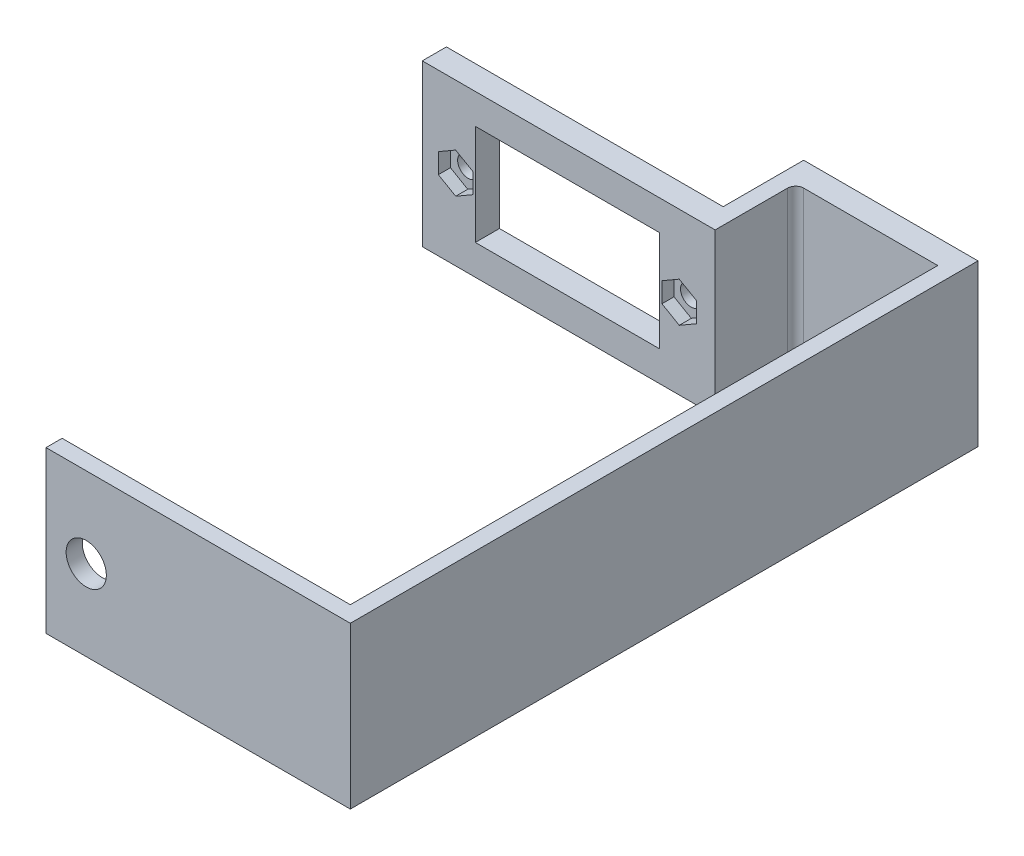
ISO-10303-21;
HEADER;
FILE_DESCRIPTION(('STEP AP214'),'2;1');
FILE_NAME('part.step','',(''),(''),'','','');
FILE_SCHEMA(('AUTOMOTIVE_DESIGN { 1 0 10303 214 1 1 1 1 }'));
ENDSEC;
DATA;
#1=APPLICATION_CONTEXT('core data for automotive mechanical design processes');
#2=APPLICATION_PROTOCOL_DEFINITION('international standard','automotive_design',2000,#1);
#3=PRODUCT_CONTEXT('',#1,'mechanical');
#4=PRODUCT('Part','Part','',(#3));
#5=PRODUCT_RELATED_PRODUCT_CATEGORY('part','',(#4));
#6=PRODUCT_DEFINITION_FORMATION('','',#4);
#7=PRODUCT_DEFINITION_CONTEXT('part definition',#1,'design');
#8=PRODUCT_DEFINITION('design','',#6,#7);
#9=PRODUCT_DEFINITION_SHAPE('','',#8);
#10=(LENGTH_UNIT() NAMED_UNIT(*) SI_UNIT(.MILLI.,.METRE.));
#11=(NAMED_UNIT(*) PLANE_ANGLE_UNIT() SI_UNIT($,.RADIAN.));
#12=(NAMED_UNIT(*) SI_UNIT($,.STERADIAN.) SOLID_ANGLE_UNIT());
#13=UNCERTAINTY_MEASURE_WITH_UNIT(LENGTH_MEASURE(1.E-05),#10,'distance_accuracy_value','');
#14=(GEOMETRIC_REPRESENTATION_CONTEXT(3) GLOBAL_UNCERTAINTY_ASSIGNED_CONTEXT((#13)) GLOBAL_UNIT_ASSIGNED_CONTEXT((#10,
#11,#12)) REPRESENTATION_CONTEXT('',''));
#15=CARTESIAN_POINT('',(0.,0.,0.));
#16=DIRECTION('',(0.,0.,1.));
#17=DIRECTION('',(1.,0.,0.));
#18=AXIS2_PLACEMENT_3D('',#15,#16,#17);
#19=CARTESIAN_POINT('',(0.,0.,-20.6321392575932));
#20=DIRECTION('',(0.,0.,1.));
#21=DIRECTION('',(1.,0.,0.));
#22=AXIS2_PLACEMENT_3D('',#19,#20,#21);
#23=PLANE('',#22);
#24=CARTESIAN_POINT('',(3.92437573669281,-24.8494813758242,-20.6321392575932));
#25=DIRECTION('',(0.,0.,-1.));
#26=DIRECTION('',(-1.,0.,0.));
#27=AXIS2_PLACEMENT_3D('',#24,#25,#26);
#28=CIRCLE('',#27,1.29999999999999);
#29=CARTESIAN_POINT('',(2.62437573669282,-24.8494813758242,-20.6321392575932));
#30=VERTEX_POINT('',#29);
#31=EDGE_CURVE('E539',#30,#30,#28,.T.);
#32=ORIENTED_EDGE('',*,*,#31,.F.);
#33=EDGE_LOOP('',(#32));
#34=FACE_BOUND('',#33,.T.);
#35=DIRECTION('',(-1.,0.,0.));
#36=VECTOR('',#35,1.);
#37=CARTESIAN_POINT('',(0.,-14.8494813758241,-20.6321392575932));
#38=LINE('',#37,#36);
#39=CARTESIAN_POINT('',(6.42437573669282,-14.8494813758241,-20.6321392575932));
#40=VERTEX_POINT('',#39);
#41=CARTESIAN_POINT('',(-27.9669682603242,-14.8494813758241,-20.6321392575932));
#42=VERTEX_POINT('',#41);
#43=EDGE_CURVE('E392',#40,#42,#38,.T.);
#44=ORIENTED_EDGE('',*,*,#43,.F.);
#45=DIRECTION('',(0.,-1.,0.));
#46=VECTOR('',#45,1.);
#47=CARTESIAN_POINT('',(6.42437573669282,0.,-20.6321392575932));
#48=LINE('',#47,#46);
#49=CARTESIAN_POINT('',(6.42437573669281,-34.8494813758241,-20.6321392575932));
#50=VERTEX_POINT('',#49);
#51=EDGE_CURVE('E359',#40,#50,#48,.T.);
#52=ORIENTED_EDGE('',*,*,#51,.T.);
#53=DIRECTION('',(-1.,0.,0.));
#54=VECTOR('',#53,1.);
#55=CARTESIAN_POINT('',(0.,-34.8494813758241,-20.6321392575932));
#56=LINE('',#55,#54);
#57=CARTESIAN_POINT('',(-27.9669682603242,-34.8494813758241,-20.6321392575932));
#58=VERTEX_POINT('',#57);
#59=EDGE_CURVE('E399',#50,#58,#56,.T.);
#60=ORIENTED_EDGE('',*,*,#59,.T.);
#61=DIRECTION('',(0.,-1.,0.));
#62=VECTOR('',#61,1.);
#63=CARTESIAN_POINT('',(-27.9669682603242,0.,-20.6321392575932));
#64=LINE('',#63,#62);
#65=EDGE_CURVE('E396',#42,#58,#64,.T.);
#66=ORIENTED_EDGE('',*,*,#65,.F.);
#67=EDGE_LOOP('',(#44,#52,#60,#66));
#68=FACE_BOUND('',#67,.T.);
#69=DIRECTION('',(1.,0.,0.));
#70=VECTOR('',#69,1.);
#71=CARTESIAN_POINT('',(0.,-18.5994813758242,-20.6321392575932));
#72=LINE('',#71,#70);
#73=CARTESIAN_POINT('',(-21.3756192633072,-18.5994813758242,-20.6321392575932));
#74=VERTEX_POINT('',#73);
#75=CARTESIAN_POINT('',(1.52437073669281,-18.5994813758242,-20.6321392575932));
#76=VERTEX_POINT('',#75);
#77=EDGE_CURVE('E353',#74,#76,#72,.T.);
#78=ORIENTED_EDGE('',*,*,#77,.F.);
#79=DIRECTION('',(0.,1.,0.));
#80=VECTOR('',#79,1.);
#81=CARTESIAN_POINT('',(-21.3756192633072,0.,-20.6321392575932));
#82=LINE('',#81,#80);
#83=CARTESIAN_POINT('',(-21.3756192633072,-31.0994813758241,-20.6321392575932));
#84=VERTEX_POINT('',#83);
#85=EDGE_CURVE('E389',#84,#74,#82,.T.);
#86=ORIENTED_EDGE('',*,*,#85,.F.);
#87=DIRECTION('',(-1.,0.,0.));
#88=VECTOR('',#87,1.);
#89=CARTESIAN_POINT('',(0.,-31.0994813758242,-20.6321392575932));
#90=LINE('',#89,#88);
#91=CARTESIAN_POINT('',(1.52437073669281,-31.0994813758242,-20.6321392575932));
#92=VERTEX_POINT('',#91);
#93=EDGE_CURVE('E386',#92,#84,#90,.T.);
#94=ORIENTED_EDGE('',*,*,#93,.F.);
#95=DIRECTION('',(0.,-1.,0.));
#96=VECTOR('',#95,1.);
#97=CARTESIAN_POINT('',(1.52437073669281,0.,-20.6321392575932));
#98=LINE('',#97,#96);
#99=EDGE_CURVE('E383',#76,#92,#98,.T.);
#100=ORIENTED_EDGE('',*,*,#99,.F.);
#101=EDGE_LOOP('',(#78,#86,#94,#100));
#102=FACE_BOUND('',#101,.T.);
#103=CARTESIAN_POINT('',(-23.7756242633072,-24.8494813758242,-20.6321392575932));
#104=DIRECTION('',(0.,0.,-1.));
#105=DIRECTION('',(-1.,0.,0.));
#106=AXIS2_PLACEMENT_3D('',#103,#104,#105);
#107=CIRCLE('',#106,1.29999999999999);
#108=CARTESIAN_POINT('',(-25.0756242633072,-24.8494813758242,-20.6321392575932));
#109=VERTEX_POINT('',#108);
#110=EDGE_CURVE('E527',#109,#109,#107,.T.);
#111=ORIENTED_EDGE('',*,*,#110,.F.);
#112=EDGE_LOOP('',(#111));
#113=FACE_BOUND('',#112,.T.);
#114=ADVANCED_FACE('F51',(#34,#68,#102,#113),#23,.F.);
#115=CARTESIAN_POINT('',(0.,0.,-17.6321392575933));
#116=DIRECTION('',(0.,0.,1.));
#117=DIRECTION('',(1.,0.,0.));
#118=AXIS2_PLACEMENT_3D('',#115,#116,#117);
#119=PLANE('',#118);
#120=DIRECTION('',(-1.,0.,0.));
#121=VECTOR('',#120,1.);
#122=CARTESIAN_POINT('',(0.,-14.8494813758241,-17.6321392575933));
#123=LINE('',#122,#121);
#124=CARTESIAN_POINT('',(8.42437573669282,-14.8494813758241,-17.6321392575933));
#125=VERTEX_POINT('',#124);
#126=CARTESIAN_POINT('',(-27.9669682603242,-14.8494813758241,-17.6321392575933));
#127=VERTEX_POINT('',#126);
#128=EDGE_CURVE('E368',#125,#127,#123,.T.);
#129=ORIENTED_EDGE('',*,*,#128,.T.);
#130=DIRECTION('',(0.,-1.,0.));
#131=VECTOR('',#130,1.);
#132=CARTESIAN_POINT('',(-27.9669682603242,0.,-17.6321392575933));
#133=LINE('',#132,#131);
#134=CARTESIAN_POINT('',(-27.9669682603242,-34.8494813758241,-17.6321392575933));
#135=VERTEX_POINT('',#134);
#136=EDGE_CURVE('E372',#127,#135,#133,.T.);
#137=ORIENTED_EDGE('',*,*,#136,.T.);
#138=DIRECTION('',(-1.,0.,0.));
#139=VECTOR('',#138,1.);
#140=CARTESIAN_POINT('',(0.,-34.8494813758241,-17.6321392575933));
#141=LINE('',#140,#139);
#142=CARTESIAN_POINT('',(8.42437573669281,-34.8494813758241,-17.6321392575933));
#143=VERTEX_POINT('',#142);
#144=EDGE_CURVE('E375',#143,#135,#141,.T.);
#145=ORIENTED_EDGE('',*,*,#144,.F.);
#146=DIRECTION('',(0.,-1.,0.));
#147=VECTOR('',#146,1.);
#148=CARTESIAN_POINT('',(8.42437573669282,-14.8494813758241,-17.6321392575933));
#149=LINE('',#148,#147);
#150=EDGE_CURVE('E274',#125,#143,#149,.T.);
#151=ORIENTED_EDGE('',*,*,#150,.F.);
#152=EDGE_LOOP('',(#129,#137,#145,#151));
#153=FACE_BOUND('',#152,.T.);
#154=DIRECTION('',(1.,0.,0.));
#155=VECTOR('',#154,1.);
#156=CARTESIAN_POINT('',(0.,-18.5994813758242,-17.6321392575933));
#157=LINE('',#156,#155);
#158=CARTESIAN_POINT('',(-21.3756192633072,-18.5994813758242,-17.6321392575933));
#159=VERTEX_POINT('',#158);
#160=CARTESIAN_POINT('',(1.52437073669281,-18.5994813758242,-17.6321392575933));
#161=VERTEX_POINT('',#160);
#162=EDGE_CURVE('E354',#159,#161,#157,.T.);
#163=ORIENTED_EDGE('',*,*,#162,.T.);
#164=DIRECTION('',(0.,-1.,0.));
#165=VECTOR('',#164,1.);
#166=CARTESIAN_POINT('',(1.52437073669281,0.,-17.6321392575933));
#167=LINE('',#166,#165);
#168=CARTESIAN_POINT('',(1.52437073669281,-31.0994813758242,-17.6321392575933));
#169=VERTEX_POINT('',#168);
#170=EDGE_CURVE('E358',#161,#169,#167,.T.);
#171=ORIENTED_EDGE('',*,*,#170,.T.);
#172=DIRECTION('',(-1.,0.,0.));
#173=VECTOR('',#172,1.);
#174=CARTESIAN_POINT('',(0.,-31.0994813758242,-17.6321392575933));
#175=LINE('',#174,#173);
#176=CARTESIAN_POINT('',(-21.3756192633072,-31.0994813758241,-17.6321392575933));
#177=VERTEX_POINT('',#176);
#178=EDGE_CURVE('E362',#169,#177,#175,.T.);
#179=ORIENTED_EDGE('',*,*,#178,.T.);
#180=DIRECTION('',(0.,1.,0.));
#181=VECTOR('',#180,1.);
#182=CARTESIAN_POINT('',(-21.3756192633072,0.,-17.6321392575933));
#183=LINE('',#182,#181);
#184=EDGE_CURVE('E365',#177,#159,#183,.T.);
#185=ORIENTED_EDGE('',*,*,#184,.T.);
#186=EDGE_LOOP('',(#163,#171,#179,#185));
#187=FACE_BOUND('',#186,.T.);
#188=DIRECTION('',(-0.866025403784438,0.500000000000001,0.));
#189=VECTOR('',#188,1.);
#190=CARTESIAN_POINT('',(-15.6447755673196,-27.0975461556097,-17.6321392575933));
#191=LINE('',#190,#189);
#192=CARTESIAN_POINT('',(-21.6669682603242,-23.6206315831918,-17.6321392575933));
#193=VERTEX_POINT('',#192);
#194=CARTESIAN_POINT('',(-23.8169682603242,-22.379328504434,-17.6321392575933));
#195=VERTEX_POINT('',#194);
#196=EDGE_CURVE('E77',#193,#195,#191,.T.);
#197=ORIENTED_EDGE('',*,*,#196,.F.);
#198=DIRECTION('',(0.,1.,0.));
#199=VECTOR('',#198,1.);
#200=CARTESIAN_POINT('',(-21.6669682603242,0.,-17.6321392575933));
#201=LINE('',#200,#199);
#202=CARTESIAN_POINT('',(-21.6669682603242,-26.1032377407071,-17.6321392575933));
#203=VERTEX_POINT('',#202);
#204=EDGE_CURVE('E286',#203,#193,#201,.T.);
#205=ORIENTED_EDGE('',*,*,#204,.F.);
#206=DIRECTION('',(0.866025403784438,0.500000000000001,0.));
#207=VECTOR('',#206,1.);
#208=CARTESIAN_POINT('',(5.8862914371575,-10.1953558373144,-17.6321392575933));
#209=LINE('',#208,#207);
#210=CARTESIAN_POINT('',(-23.8169682603242,-27.3445408194648,-17.6321392575933));
#211=VERTEX_POINT('',#210);
#212=EDGE_CURVE('E322',#211,#203,#209,.T.);
#213=ORIENTED_EDGE('',*,*,#212,.F.);
#214=DIRECTION('',(0.866025403784439,-0.5,0.));
#215=VECTOR('',#214,1.);
#216=CARTESIAN_POINT('',(-17.7947755673196,-30.8214553918828,-17.6321392575933));
#217=LINE('',#216,#215);
#218=CARTESIAN_POINT('',(-25.9669682603242,-26.1032377407071,-17.6321392575933));
#219=VERTEX_POINT('',#218);
#220=EDGE_CURVE('E318',#219,#211,#217,.T.);
#221=ORIENTED_EDGE('',*,*,#220,.F.);
#222=DIRECTION('',(0.,-1.,0.));
#223=VECTOR('',#222,1.);
#224=CARTESIAN_POINT('',(-25.9669682603242,0.,-17.6321392575933));
#225=LINE('',#224,#223);
#226=CARTESIAN_POINT('',(-25.9669682603242,-23.6206315831917,-17.6321392575933));
#227=VERTEX_POINT('',#226);
#228=EDGE_CURVE('E314',#227,#219,#225,.T.);
#229=ORIENTED_EDGE('',*,*,#228,.F.);
#230=DIRECTION('',(-0.866025403784438,-0.500000000000001,0.));
#231=VECTOR('',#230,1.);
#232=CARTESIAN_POINT('',(3.7362914371575,-6.47144660104132,-17.6321392575933));
#233=LINE('',#232,#231);
#234=EDGE_CURVE('E309',#195,#227,#233,.T.);
#235=ORIENTED_EDGE('',*,*,#234,.F.);
#236=EDGE_LOOP('',(#197,#205,#213,#221,#229,#235));
#237=FACE_BOUND('',#236,.T.);
#238=DIRECTION('',(0.866025403784439,-0.5,0.));
#239=VECTOR('',#238,1.);
#240=CARTESIAN_POINT('',(-8.69910356881111,-15.0672893614846,-17.6321392575933));
#241=LINE('',#240,#239);
#242=CARTESIAN_POINT('',(3.96571973370978,-22.3793285044341,-17.6321392575933));
#243=VERTEX_POINT('',#242);
#244=CARTESIAN_POINT('',(6.11571973370978,-23.6206315831918,-17.6321392575933));
#245=VERTEX_POINT('',#244);
#246=EDGE_CURVE('E262',#243,#245,#241,.T.);
#247=ORIENTED_EDGE('',*,*,#246,.T.);
#248=DIRECTION('',(0.,-1.,0.));
#249=VECTOR('',#248,1.);
#250=CARTESIAN_POINT('',(6.11571973370978,0.,-17.6321392575933));
#251=LINE('',#250,#249);
#252=CARTESIAN_POINT('',(6.11571973370978,-26.1032377407071,-17.6321392575933));
#253=VERTEX_POINT('',#252);
#254=EDGE_CURVE('E69',#245,#253,#251,.T.);
#255=ORIENTED_EDGE('',*,*,#254,.T.);
#256=DIRECTION('',(-0.866025403784439,-0.499999999999999,0.));
#257=VECTOR('',#256,1.);
#258=CARTESIAN_POINT('',(12.831963435666,-22.2256126314396,-17.6321392575933));
#259=LINE('',#258,#257);
#260=CARTESIAN_POINT('',(3.96571973370977,-27.3445408194648,-17.6321392575933));
#261=VERTEX_POINT('',#260);
#262=EDGE_CURVE('E266',#253,#261,#259,.T.);
#263=ORIENTED_EDGE('',*,*,#262,.T.);
#264=DIRECTION('',(-0.866025403784438,0.500000000000001,0.));
#265=VECTOR('',#264,1.);
#266=CARTESIAN_POINT('',(-10.8491035688111,-18.7911985977576,-17.6321392575933));
#267=LINE('',#266,#265);
#268=CARTESIAN_POINT('',(1.81571973370978,-26.1032377407071,-17.6321392575933));
#269=VERTEX_POINT('',#268);
#270=EDGE_CURVE('E557',#261,#269,#267,.T.);
#271=ORIENTED_EDGE('',*,*,#270,.T.);
#272=DIRECTION('',(0.,1.,0.));
#273=VECTOR('',#272,1.);
#274=CARTESIAN_POINT('',(1.81571973370978,0.,-17.6321392575933));
#275=LINE('',#274,#273);
#276=CARTESIAN_POINT('',(1.81571973370977,-23.6206315831918,-17.6321392575933));
#277=VERTEX_POINT('',#276);
#278=EDGE_CURVE('E561',#269,#277,#275,.T.);
#279=ORIENTED_EDGE('',*,*,#278,.T.);
#280=DIRECTION('',(0.866025403784438,0.5,0.));
#281=VECTOR('',#280,1.);
#282=CARTESIAN_POINT('',(10.681963435666,-18.5017033951665,-17.6321392575933));
#283=LINE('',#282,#281);
#284=EDGE_CURVE('E565',#277,#243,#283,.T.);
#285=ORIENTED_EDGE('',*,*,#284,.T.);
#286=EDGE_LOOP('',(#247,#255,#263,#271,#279,#285));
#287=FACE_BOUND('',#286,.T.);
#288=ADVANCED_FACE('F592',(#153,#187,#237,#287),#119,.T.);
#289=CARTESIAN_POINT('',(28.09,-34.8494813758241,45.3678607424067));
#290=DIRECTION('',(0.,1.,0.));
#291=DIRECTION('',(0.,0.,1.));
#292=AXIS2_PLACEMENT_3D('',#289,#290,#291);
#293=PLANE('',#292);
#294=DIRECTION('',(0.,0.,-1.));
#295=VECTOR('',#294,1.);
#296=CARTESIAN_POINT('',(26.09,-34.8494813758241,45.3678607424067));
#297=LINE('',#296,#295);
#298=CARTESIAN_POINT('',(26.09,-34.8494813758242,45.3678607424067));
#299=VERTEX_POINT('',#298);
#300=CARTESIAN_POINT('',(26.09,-34.8494813758241,-27.6321392575933));
#301=VERTEX_POINT('',#300);
#302=EDGE_CURVE('E496',#299,#301,#297,.T.);
#303=ORIENTED_EDGE('',*,*,#302,.T.);
#304=DIRECTION('',(-1.,0.,0.));
#305=VECTOR('',#304,1.);
#306=CARTESIAN_POINT('',(28.09,-34.8494813758241,-27.6321392575933));
#307=LINE('',#306,#305);
#308=CARTESIAN_POINT('',(9.42437573669282,-34.8494813758241,-27.6321392575933));
#309=VERTEX_POINT('',#308);
#310=EDGE_CURVE('E414',#301,#309,#307,.T.);
#311=ORIENTED_EDGE('',*,*,#310,.T.);
#312=CARTESIAN_POINT('',(9.42437573669282,-34.8494813758241,-26.6321392575933));
#313=DIRECTION('',(0.,1.,0.));
#314=DIRECTION('',(0.,0.,1.));
#315=AXIS2_PLACEMENT_3D('',#312,#313,#314);
#316=CIRCLE('',#315,1.);
#317=CARTESIAN_POINT('',(8.42437573669281,-34.8494813758241,-26.6321392575933));
#318=VERTEX_POINT('',#317);
#319=EDGE_CURVE('E11',#309,#318,#316,.T.);
#320=ORIENTED_EDGE('',*,*,#319,.T.);
#321=DIRECTION('',(0.,0.,-1.));
#322=VECTOR('',#321,1.);
#323=CARTESIAN_POINT('',(8.42437573669281,-34.8494813758241,-17.6321392575933));
#324=LINE('',#323,#322);
#325=EDGE_CURVE('E349',#143,#318,#324,.T.);
#326=ORIENTED_EDGE('',*,*,#325,.F.);
#327=ORIENTED_EDGE('',*,*,#144,.T.);
#328=DIRECTION('',(0.,0.,-1.));
#329=VECTOR('',#328,1.);
#330=CARTESIAN_POINT('',(-27.9669682603242,-34.8494813758241,-17.6321392575933));
#331=LINE('',#330,#329);
#332=EDGE_CURVE('E406',#135,#58,#331,.T.);
#333=ORIENTED_EDGE('',*,*,#332,.T.);
#334=ORIENTED_EDGE('',*,*,#59,.F.);
#335=DIRECTION('',(0.,0.,1.));
#336=VECTOR('',#335,1.);
#337=CARTESIAN_POINT('',(6.42437573669281,-34.8494813758241,-30.6321392575933));
#338=LINE('',#337,#336);
#339=CARTESIAN_POINT('',(6.42437573669281,-34.8494813758241,-30.6321392575933));
#340=VERTEX_POINT('',#339);
#341=EDGE_CURVE('E453',#340,#50,#338,.T.);
#342=ORIENTED_EDGE('',*,*,#341,.F.);
#343=DIRECTION('',(-1.,0.,0.));
#344=VECTOR('',#343,1.);
#345=CARTESIAN_POINT('',(28.09,-34.8494813758241,-30.6321392575933));
#346=LINE('',#345,#344);
#347=CARTESIAN_POINT('',(28.09,-34.8494813758241,-30.6321392575933));
#348=VERTEX_POINT('',#347);
#349=EDGE_CURVE('E429',#348,#340,#346,.T.);
#350=ORIENTED_EDGE('',*,*,#349,.F.);
#351=DIRECTION('',(0.,0.,-1.));
#352=VECTOR('',#351,1.);
#353=CARTESIAN_POINT('',(28.09,-34.8494813758241,45.3678607424067));
#354=LINE('',#353,#352);
#355=CARTESIAN_POINT('',(28.09,-34.8494813758242,47.3678607424068));
#356=VERTEX_POINT('',#355);
#357=EDGE_CURVE('E497',#356,#348,#354,.T.);
#358=ORIENTED_EDGE('',*,*,#357,.F.);
#359=DIRECTION('',(1.,0.,0.));
#360=VECTOR('',#359,1.);
#361=CARTESIAN_POINT('',(28.09,-34.8494813758242,47.3678607424068));
#362=LINE('',#361,#360);
#363=CARTESIAN_POINT('',(-9.72562926330718,-34.8494813758242,47.3678607424068));
#364=VERTEX_POINT('',#363);
#365=EDGE_CURVE('E476',#364,#356,#362,.T.);
#366=ORIENTED_EDGE('',*,*,#365,.F.);
#367=DIRECTION('',(0.,0.,-1.));
#368=VECTOR('',#367,1.);
#369=CARTESIAN_POINT('',(-9.72562926330718,-34.8494813758242,47.3678607424068));
#370=LINE('',#369,#368);
#371=CARTESIAN_POINT('',(-9.72562926330718,-34.8494813758242,45.3678607424067));
#372=VERTEX_POINT('',#371);
#373=EDGE_CURVE('E480',#364,#372,#370,.T.);
#374=ORIENTED_EDGE('',*,*,#373,.T.);
#375=DIRECTION('',(1.,0.,0.));
#376=VECTOR('',#375,1.);
#377=CARTESIAN_POINT('',(28.09,-34.8494813758242,45.3678607424067));
#378=LINE('',#377,#376);
#379=EDGE_CURVE('E470',#372,#299,#378,.T.);
#380=ORIENTED_EDGE('',*,*,#379,.T.);
#381=EDGE_LOOP('',(#303,#311,#320,#326,#327,#333,#334,#342,#350,#358,#366,#374,#380));
#382=FACE_BOUND('',#381,.T.);
#383=ADVANCED_FACE('F613',(#382),#293,.F.);
#384=CARTESIAN_POINT('',(28.09,-14.8494813758241,45.3678607424067));
#385=DIRECTION('',(0.,-1.,0.));
#386=DIRECTION('',(0.,0.,-1.));
#387=AXIS2_PLACEMENT_3D('',#384,#385,#386);
#388=PLANE('',#387);
#389=DIRECTION('',(0.,0.,1.));
#390=VECTOR('',#389,1.);
#391=CARTESIAN_POINT('',(26.09,-14.8494813758241,45.3678607424067));
#392=LINE('',#391,#390);
#393=CARTESIAN_POINT('',(26.09,-14.8494813758241,-27.6321392575933));
#394=VERTEX_POINT('',#393);
#395=CARTESIAN_POINT('',(26.09,-14.8494813758241,45.3678607424067));
#396=VERTEX_POINT('',#395);
#397=EDGE_CURVE('E512',#394,#396,#392,.T.);
#398=ORIENTED_EDGE('',*,*,#397,.T.);
#399=DIRECTION('',(-1.,0.,0.));
#400=VECTOR('',#399,1.);
#401=CARTESIAN_POINT('',(28.09,-14.8494813758241,45.3678607424067));
#402=LINE('',#401,#400);
#403=CARTESIAN_POINT('',(-9.72562926330718,-14.8494813758241,45.3678607424067));
#404=VERTEX_POINT('',#403);
#405=EDGE_CURVE('E461',#396,#404,#402,.T.);
#406=ORIENTED_EDGE('',*,*,#405,.T.);
#407=DIRECTION('',(0.,0.,-1.));
#408=VECTOR('',#407,1.);
#409=CARTESIAN_POINT('',(-9.72562926330718,-14.8494813758241,47.3678607424068));
#410=LINE('',#409,#408);
#411=CARTESIAN_POINT('',(-9.72562926330718,-14.8494813758241,47.3678607424068));
#412=VERTEX_POINT('',#411);
#413=EDGE_CURVE('E492',#412,#404,#410,.T.);
#414=ORIENTED_EDGE('',*,*,#413,.F.);
#415=DIRECTION('',(-1.,0.,0.));
#416=VECTOR('',#415,1.);
#417=CARTESIAN_POINT('',(28.09,-14.8494813758241,47.3678607424068));
#418=LINE('',#417,#416);
#419=CARTESIAN_POINT('',(28.09,-14.8494813758241,47.3678607424068));
#420=VERTEX_POINT('',#419);
#421=EDGE_CURVE('E469',#420,#412,#418,.T.);
#422=ORIENTED_EDGE('',*,*,#421,.F.);
#423=DIRECTION('',(0.,0.,1.));
#424=VECTOR('',#423,1.);
#425=CARTESIAN_POINT('',(28.09,-14.8494813758241,45.3678607424067));
#426=LINE('',#425,#424);
#427=CARTESIAN_POINT('',(28.09,-14.8494813758241,-30.6321392575933));
#428=VERTEX_POINT('',#427);
#429=EDGE_CURVE('E500',#428,#420,#426,.T.);
#430=ORIENTED_EDGE('',*,*,#429,.F.);
#431=DIRECTION('',(1.,0.,0.));
#432=VECTOR('',#431,1.);
#433=CARTESIAN_POINT('',(28.09,-14.8494813758241,-30.6321392575933));
#434=LINE('',#433,#432);
#435=CARTESIAN_POINT('',(6.42437573669282,-14.8494813758241,-30.6321392575933));
#436=VERTEX_POINT('',#435);
#437=EDGE_CURVE('E437',#436,#428,#434,.T.);
#438=ORIENTED_EDGE('',*,*,#437,.F.);
#439=DIRECTION('',(0.,0.,1.));
#440=VECTOR('',#439,1.);
#441=CARTESIAN_POINT('',(6.42437573669282,-14.8494813758241,-30.6321392575933));
#442=LINE('',#441,#440);
#443=EDGE_CURVE('E445',#436,#40,#442,.T.);
#444=ORIENTED_EDGE('',*,*,#443,.T.);
#445=ORIENTED_EDGE('',*,*,#43,.T.);
#446=DIRECTION('',(0.,0.,-1.));
#447=VECTOR('',#446,1.);
#448=CARTESIAN_POINT('',(-27.9669682603242,-14.8494813758241,-17.6321392575933));
#449=LINE('',#448,#447);
#450=EDGE_CURVE('E409',#127,#42,#449,.T.);
#451=ORIENTED_EDGE('',*,*,#450,.F.);
#452=ORIENTED_EDGE('',*,*,#128,.F.);
#453=DIRECTION('',(0.,0.,1.));
#454=VECTOR('',#453,1.);
#455=CARTESIAN_POINT('',(8.42437573669282,-14.8494813758241,-27.6321392575933));
#456=LINE('',#455,#454);
#457=CARTESIAN_POINT('',(8.42437573669282,-14.8494813758241,-26.6321392575933));
#458=VERTEX_POINT('',#457);
#459=EDGE_CURVE('E268',#458,#125,#456,.T.);
#460=ORIENTED_EDGE('',*,*,#459,.F.);
#461=CARTESIAN_POINT('',(9.42437573669282,-14.8494813758241,-26.6321392575933));
#462=DIRECTION('',(0.,-1.,0.));
#463=DIRECTION('',(0.,0.,-1.));
#464=AXIS2_PLACEMENT_3D('',#461,#462,#463);
#465=CIRCLE('',#464,1.);
#466=CARTESIAN_POINT('',(9.42437573669282,-14.8494813758241,-27.6321392575933));
#467=VERTEX_POINT('',#466);
#468=EDGE_CURVE('E61',#458,#467,#465,.T.);
#469=ORIENTED_EDGE('',*,*,#468,.T.);
#470=DIRECTION('',(1.,0.,0.));
#471=VECTOR('',#470,1.);
#472=CARTESIAN_POINT('',(28.09,-14.8494813758241,-27.6321392575933));
#473=LINE('',#472,#471);
#474=EDGE_CURVE('E434',#467,#394,#473,.T.);
#475=ORIENTED_EDGE('',*,*,#474,.T.);
#476=EDGE_LOOP('',(#398,#406,#414,#422,#430,#438,#444,#445,#451,#452,#460,#469,#475));
#477=FACE_BOUND('',#476,.T.);
#478=ADVANCED_FACE('F673',(#477),#388,.F.);
#479=CARTESIAN_POINT('',(28.09,0.,0.));
#480=DIRECTION('',(1.,0.,0.));
#481=DIRECTION('',(0.,0.,-1.));
#482=AXIS2_PLACEMENT_3D('',#479,#480,#481);
#483=PLANE('',#482);
#484=ORIENTED_EDGE('',*,*,#357,.T.);
#485=DIRECTION('',(0.,-1.,0.));
#486=VECTOR('',#485,1.);
#487=CARTESIAN_POINT('',(28.09,-34.8494813758241,-30.6321392575933));
#488=LINE('',#487,#486);
#489=EDGE_CURVE('E441',#428,#348,#488,.T.);
#490=ORIENTED_EDGE('',*,*,#489,.F.);
#491=ORIENTED_EDGE('',*,*,#429,.T.);
#492=DIRECTION('',(0.,1.,0.));
#493=VECTOR('',#492,1.);
#494=CARTESIAN_POINT('',(28.09,-34.8494813758242,47.3678607424068));
#495=LINE('',#494,#493);
#496=EDGE_CURVE('E465',#356,#420,#495,.T.);
#497=ORIENTED_EDGE('',*,*,#496,.F.);
#498=EDGE_LOOP('',(#484,#490,#491,#497));
#499=FACE_BOUND('',#498,.T.);
#500=ADVANCED_FACE('F670',(#499),#483,.T.);
#501=CARTESIAN_POINT('',(26.09,0.,0.));
#502=DIRECTION('',(1.,0.,0.));
#503=DIRECTION('',(0.,0.,-1.));
#504=AXIS2_PLACEMENT_3D('',#501,#502,#503);
#505=PLANE('',#504);
#506=ORIENTED_EDGE('',*,*,#302,.F.);
#507=DIRECTION('',(0.,-1.,0.));
#508=VECTOR('',#507,1.);
#509=CARTESIAN_POINT('',(26.09,-34.8494813758241,45.3678607424067));
#510=LINE('',#509,#508);
#511=EDGE_CURVE('E501',#396,#299,#510,.T.);
#512=ORIENTED_EDGE('',*,*,#511,.F.);
#513=ORIENTED_EDGE('',*,*,#397,.F.);
#514=DIRECTION('',(0.,1.,0.));
#515=VECTOR('',#514,1.);
#516=CARTESIAN_POINT('',(26.09,-34.8494813758241,-27.6321392575933));
#517=LINE('',#516,#515);
#518=EDGE_CURVE('E508',#301,#394,#517,.T.);
#519=ORIENTED_EDGE('',*,*,#518,.F.);
#520=EDGE_LOOP('',(#506,#512,#513,#519));
#521=FACE_BOUND('',#520,.T.);
#522=ADVANCED_FACE('F665',(#521),#505,.F.);
#523=CARTESIAN_POINT('',(0.,0.,45.3678607424067));
#524=DIRECTION('',(0.,0.,1.));
#525=DIRECTION('',(1.,0.,0.));
#526=AXIS2_PLACEMENT_3D('',#523,#524,#525);
#527=PLANE('',#526);
#528=CARTESIAN_POINT('',(-4.72562926330719,-24.8494813758241,45.3678607424067));
#529=DIRECTION('',(0.,0.,1.));
#530=DIRECTION('',(1.,0.,0.));
#531=AXIS2_PLACEMENT_3D('',#528,#529,#530);
#532=CIRCLE('',#531,2.5);
#533=CARTESIAN_POINT('',(-2.22562926330719,-24.8494813758241,45.3678607424067));
#534=VERTEX_POINT('',#533);
#535=EDGE_CURVE('E456',#534,#534,#532,.T.);
#536=ORIENTED_EDGE('',*,*,#535,.T.);
#537=EDGE_LOOP('',(#536));
#538=FACE_BOUND('',#537,.T.);
#539=ORIENTED_EDGE('',*,*,#405,.F.);
#540=ORIENTED_EDGE('',*,*,#511,.T.);
#541=ORIENTED_EDGE('',*,*,#379,.F.);
#542=DIRECTION('',(0.,-1.,0.));
#543=VECTOR('',#542,1.);
#544=CARTESIAN_POINT('',(-9.72562926330718,-34.8494813758242,45.3678607424067));
#545=LINE('',#544,#543);
#546=EDGE_CURVE('E483',#404,#372,#545,.T.);
#547=ORIENTED_EDGE('',*,*,#546,.F.);
#548=EDGE_LOOP('',(#539,#540,#541,#547));
#549=FACE_BOUND('',#548,.T.);
#550=ADVANCED_FACE('F661',(#538,#549),#527,.F.);
#551=CARTESIAN_POINT('',(0.,0.,47.3678607424068));
#552=DIRECTION('',(0.,0.,1.));
#553=DIRECTION('',(1.,0.,0.));
#554=AXIS2_PLACEMENT_3D('',#551,#552,#553);
#555=PLANE('',#554);
#556=ORIENTED_EDGE('',*,*,#496,.T.);
#557=ORIENTED_EDGE('',*,*,#421,.T.);
#558=DIRECTION('',(0.,-1.,0.));
#559=VECTOR('',#558,1.);
#560=CARTESIAN_POINT('',(-9.72562926330718,-34.8494813758242,47.3678607424068));
#561=LINE('',#560,#559);
#562=EDGE_CURVE('E473',#412,#364,#561,.T.);
#563=ORIENTED_EDGE('',*,*,#562,.T.);
#564=ORIENTED_EDGE('',*,*,#365,.T.);
#565=EDGE_LOOP('',(#556,#557,#563,#564));
#566=FACE_BOUND('',#565,.T.);
#567=CARTESIAN_POINT('',(-4.72562926330719,-24.8494813758241,47.3678607424068));
#568=DIRECTION('',(0.,0.,1.));
#569=DIRECTION('',(1.,0.,0.));
#570=AXIS2_PLACEMENT_3D('',#567,#568,#569);
#571=CIRCLE('',#570,2.5);
#572=CARTESIAN_POINT('',(-2.22562926330719,-24.8494813758241,47.3678607424068));
#573=VERTEX_POINT('',#572);
#574=EDGE_CURVE('E457',#573,#573,#571,.T.);
#575=ORIENTED_EDGE('',*,*,#574,.F.);
#576=EDGE_LOOP('',(#575));
#577=FACE_BOUND('',#576,.T.);
#578=ADVANCED_FACE('F658',(#566,#577),#555,.T.);
#579=CARTESIAN_POINT('',(-9.72562926330718,-34.8494813758242,47.3678607424068));
#580=DIRECTION('',(1.,0.,0.));
#581=DIRECTION('',(0.,0.,-1.));
#582=AXIS2_PLACEMENT_3D('',#579,#580,#581);
#583=PLANE('',#582);
#584=ORIENTED_EDGE('',*,*,#546,.T.);
#585=ORIENTED_EDGE('',*,*,#373,.F.);
#586=ORIENTED_EDGE('',*,*,#562,.F.);
#587=ORIENTED_EDGE('',*,*,#413,.T.);
#588=EDGE_LOOP('',(#584,#585,#586,#587));
#589=FACE_BOUND('',#588,.T.);
#590=ADVANCED_FACE('F656',(#589),#583,.F.);
#591=CARTESIAN_POINT('',(-4.72562926330719,-24.8494813758241,47.3678607424068));
#592=DIRECTION('',(0.,0.,-1.));
#593=DIRECTION('',(-1.,0.,0.));
#594=AXIS2_PLACEMENT_3D('',#591,#592,#593);
#595=CYLINDRICAL_SURFACE('',#594,2.5);
#596=ORIENTED_EDGE('',*,*,#574,.T.);
#597=EDGE_LOOP('',(#596));
#598=FACE_BOUND('',#597,.T.);
#599=ORIENTED_EDGE('',*,*,#535,.F.);
#600=EDGE_LOOP('',(#599));
#601=FACE_BOUND('',#600,.T.);
#602=ADVANCED_FACE('F649',(#598,#601),#595,.F.);
#603=CARTESIAN_POINT('',(0.,0.,-27.6321392575933));
#604=DIRECTION('',(0.,0.,-1.));
#605=DIRECTION('',(0.,1.,0.));
#606=AXIS2_PLACEMENT_3D('',#603,#604,#605);
#607=PLANE('',#606);
#608=ORIENTED_EDGE('',*,*,#474,.F.);
#609=DIRECTION('',(0.,1.,0.));
#610=VECTOR('',#609,1.);
#611=CARTESIAN_POINT('',(9.42437573669282,0.,-27.6321392575933));
#612=LINE('',#611,#610);
#613=EDGE_CURVE('E521',#467,#309,#612,.F.);
#614=ORIENTED_EDGE('',*,*,#613,.T.);
#615=ORIENTED_EDGE('',*,*,#310,.F.);
#616=ORIENTED_EDGE('',*,*,#518,.T.);
#617=EDGE_LOOP('',(#608,#614,#615,#616));
#618=FACE_BOUND('',#617,.T.);
#619=ADVANCED_FACE('F646',(#618),#607,.F.);
#620=CARTESIAN_POINT('',(6.42437573669281,-34.8494813758241,-30.6321392575933));
#621=DIRECTION('',(1.,0.,0.));
#622=DIRECTION('',(0.,1.,0.));
#623=AXIS2_PLACEMENT_3D('',#620,#621,#622);
#624=PLANE('',#623);
#625=ORIENTED_EDGE('',*,*,#341,.T.);
#626=ORIENTED_EDGE('',*,*,#51,.F.);
#627=ORIENTED_EDGE('',*,*,#443,.F.);
#628=DIRECTION('',(0.,1.,0.));
#629=VECTOR('',#628,1.);
#630=CARTESIAN_POINT('',(6.42437573669281,-34.8494813758241,-30.6321392575933));
#631=LINE('',#630,#629);
#632=EDGE_CURVE('E433',#340,#436,#631,.T.);
#633=ORIENTED_EDGE('',*,*,#632,.F.);
#634=EDGE_LOOP('',(#625,#626,#627,#633));
#635=FACE_BOUND('',#634,.T.);
#636=ADVANCED_FACE('F644',(#635),#624,.F.);
#637=CARTESIAN_POINT('',(0.,0.,-30.6321392575933));
#638=DIRECTION('',(0.,0.,-1.));
#639=DIRECTION('',(0.,1.,0.));
#640=AXIS2_PLACEMENT_3D('',#637,#638,#639);
#641=PLANE('',#640);
#642=ORIENTED_EDGE('',*,*,#349,.T.);
#643=ORIENTED_EDGE('',*,*,#632,.T.);
#644=ORIENTED_EDGE('',*,*,#437,.T.);
#645=ORIENTED_EDGE('',*,*,#489,.T.);
#646=EDGE_LOOP('',(#642,#643,#644,#645));
#647=FACE_BOUND('',#646,.T.);
#648=ADVANCED_FACE('F624',(#647),#641,.T.);
#649=CARTESIAN_POINT('',(-27.9669682603242,0.,-17.6321392575933));
#650=DIRECTION('',(1.,0.,0.));
#651=DIRECTION('',(0.,1.,0.));
#652=AXIS2_PLACEMENT_3D('',#649,#650,#651);
#653=PLANE('',#652);
#654=ORIENTED_EDGE('',*,*,#65,.T.);
#655=ORIENTED_EDGE('',*,*,#332,.F.);
#656=ORIENTED_EDGE('',*,*,#136,.F.);
#657=ORIENTED_EDGE('',*,*,#450,.T.);
#658=EDGE_LOOP('',(#654,#655,#656,#657));
#659=FACE_BOUND('',#658,.T.);
#660=ADVANCED_FACE('F620',(#659),#653,.F.);
#661=CARTESIAN_POINT('',(0.,-18.5994813758242,-17.6321392575933));
#662=DIRECTION('',(0.,1.,0.));
#663=DIRECTION('',(-1.,0.,0.));
#664=AXIS2_PLACEMENT_3D('',#661,#662,#663);
#665=PLANE('',#664);
#666=ORIENTED_EDGE('',*,*,#77,.T.);
#667=DIRECTION('',(0.,0.,-1.));
#668=VECTOR('',#667,1.);
#669=CARTESIAN_POINT('',(1.52437073669281,-18.5994813758242,-17.6321392575933));
#670=LINE('',#669,#668);
#671=EDGE_CURVE('E410',#161,#76,#670,.T.);
#672=ORIENTED_EDGE('',*,*,#671,.F.);
#673=ORIENTED_EDGE('',*,*,#162,.F.);
#674=DIRECTION('',(0.,0.,-1.));
#675=VECTOR('',#674,1.);
#676=CARTESIAN_POINT('',(-21.3756192633072,-18.5994813758242,-17.6321392575933));
#677=LINE('',#676,#675);
#678=EDGE_CURVE('E379',#159,#74,#677,.T.);
#679=ORIENTED_EDGE('',*,*,#678,.T.);
#680=EDGE_LOOP('',(#666,#672,#673,#679));
#681=FACE_BOUND('',#680,.T.);
#682=ADVANCED_FACE('F623',(#681),#665,.F.);
#683=CARTESIAN_POINT('',(1.52437073669281,0.,-17.6321392575933));
#684=DIRECTION('',(1.,0.,0.));
#685=DIRECTION('',(0.,0.,-1.));
#686=AXIS2_PLACEMENT_3D('',#683,#684,#685);
#687=PLANE('',#686);
#688=ORIENTED_EDGE('',*,*,#99,.T.);
#689=DIRECTION('',(0.,0.,-1.));
#690=VECTOR('',#689,1.);
#691=CARTESIAN_POINT('',(1.52437073669281,-31.0994813758242,-17.6321392575933));
#692=LINE('',#691,#690);
#693=EDGE_CURVE('E422',#169,#92,#692,.T.);
#694=ORIENTED_EDGE('',*,*,#693,.F.);
#695=ORIENTED_EDGE('',*,*,#170,.F.);
#696=ORIENTED_EDGE('',*,*,#671,.T.);
#697=EDGE_LOOP('',(#688,#694,#695,#696));
#698=FACE_BOUND('',#697,.T.);
#699=ADVANCED_FACE('F634',(#698),#687,.F.);
#700=CARTESIAN_POINT('',(0.,-31.0994813758242,-17.6321392575933));
#701=DIRECTION('',(0.,-1.,0.));
#702=DIRECTION('',(1.,0.,0.));
#703=AXIS2_PLACEMENT_3D('',#700,#701,#702);
#704=PLANE('',#703);
#705=ORIENTED_EDGE('',*,*,#93,.T.);
#706=DIRECTION('',(0.,0.,-1.));
#707=VECTOR('',#706,1.);
#708=CARTESIAN_POINT('',(-21.3756192633072,-31.0994813758241,-17.6321392575933));
#709=LINE('',#708,#707);
#710=EDGE_CURVE('E418',#177,#84,#709,.T.);
#711=ORIENTED_EDGE('',*,*,#710,.F.);
#712=ORIENTED_EDGE('',*,*,#178,.F.);
#713=ORIENTED_EDGE('',*,*,#693,.T.);
#714=EDGE_LOOP('',(#705,#711,#712,#713));
#715=FACE_BOUND('',#714,.T.);
#716=ADVANCED_FACE('F630',(#715),#704,.F.);
#717=CARTESIAN_POINT('',(-21.3756192633072,0.,-17.6321392575933));
#718=DIRECTION('',(-1.,0.,0.));
#719=DIRECTION('',(0.,0.,1.));
#720=AXIS2_PLACEMENT_3D('',#717,#718,#719);
#721=PLANE('',#720);
#722=ORIENTED_EDGE('',*,*,#85,.T.);
#723=ORIENTED_EDGE('',*,*,#678,.F.);
#724=ORIENTED_EDGE('',*,*,#184,.F.);
#725=ORIENTED_EDGE('',*,*,#710,.T.);
#726=EDGE_LOOP('',(#722,#723,#724,#725));
#727=FACE_BOUND('',#726,.T.);
#728=ADVANCED_FACE('F626',(#727),#721,.F.);
#729=CARTESIAN_POINT('',(8.42437573669282,0.,0.));
#730=DIRECTION('',(1.,0.,0.));
#731=DIRECTION('',(0.,1.,0.));
#732=AXIS2_PLACEMENT_3D('',#729,#730,#731);
#733=PLANE('',#732);
#734=ORIENTED_EDGE('',*,*,#325,.T.);
#735=DIRECTION('',(0.,1.,0.));
#736=VECTOR('',#735,1.);
#737=CARTESIAN_POINT('',(8.42437573669282,0.,-26.6321392575933));
#738=LINE('',#737,#736);
#739=EDGE_CURVE('E504',#318,#458,#738,.T.);
#740=ORIENTED_EDGE('',*,*,#739,.T.);
#741=ORIENTED_EDGE('',*,*,#459,.T.);
#742=ORIENTED_EDGE('',*,*,#150,.T.);
#743=EDGE_LOOP('',(#734,#740,#741,#742));
#744=FACE_BOUND('',#743,.T.);
#745=ADVANCED_FACE('F629',(#744),#733,.T.);
#746=CARTESIAN_POINT('',(9.42437573669282,0.,-26.6321392575933));
#747=DIRECTION('',(0.,1.,0.));
#748=DIRECTION('',(0.,0.,1.));
#749=AXIS2_PLACEMENT_3D('',#746,#747,#748);
#750=CYLINDRICAL_SURFACE('',#749,1.);
#751=ORIENTED_EDGE('',*,*,#319,.F.);
#752=ORIENTED_EDGE('',*,*,#613,.F.);
#753=ORIENTED_EDGE('',*,*,#468,.F.);
#754=ORIENTED_EDGE('',*,*,#739,.F.);
#755=EDGE_LOOP('',(#751,#752,#753,#754));
#756=FACE_BOUND('',#755,.T.);
#757=ADVANCED_FACE('F53',(#756),#750,.F.);
#758=CARTESIAN_POINT('',(0.,0.,-19.1321392575933));
#759=DIRECTION('',(0.,0.,1.));
#760=DIRECTION('',(1.,0.,0.));
#761=AXIS2_PLACEMENT_3D('',#758,#759,#760);
#762=PLANE('',#761);
#763=CARTESIAN_POINT('',(-23.7756242633072,-24.8494813758242,-19.1321392575933));
#764=DIRECTION('',(0.,0.,1.));
#765=DIRECTION('',(1.,0.,0.));
#766=AXIS2_PLACEMENT_3D('',#763,#764,#765);
#767=CIRCLE('',#766,1.29999999999999);
#768=CARTESIAN_POINT('',(-22.4756242633072,-24.8494813758242,-19.1321392575933));
#769=VERTEX_POINT('',#768);
#770=EDGE_CURVE('E310',#769,#769,#767,.T.);
#771=ORIENTED_EDGE('',*,*,#770,.F.);
#772=EDGE_LOOP('',(#771));
#773=FACE_BOUND('',#772,.T.);
#774=DIRECTION('',(-0.866025403784438,0.500000000000001,0.));
#775=VECTOR('',#774,1.);
#776=CARTESIAN_POINT('',(-15.6447755673196,-27.0975461556097,-19.1321392575933));
#777=LINE('',#776,#775);
#778=CARTESIAN_POINT('',(-21.6669682603242,-23.6206315831918,-19.1321392575933));
#779=VERTEX_POINT('',#778);
#780=CARTESIAN_POINT('',(-23.8169682603242,-22.379328504434,-19.1321392575933));
#781=VERTEX_POINT('',#780);
#782=EDGE_CURVE('E281',#779,#781,#777,.T.);
#783=ORIENTED_EDGE('',*,*,#782,.T.);
#784=DIRECTION('',(-0.866025403784438,-0.500000000000001,0.));
#785=VECTOR('',#784,1.);
#786=CARTESIAN_POINT('',(3.7362914371575,-6.47144660104132,-19.1321392575933));
#787=LINE('',#786,#785);
#788=CARTESIAN_POINT('',(-25.9669682603242,-23.6206315831917,-19.1321392575933));
#789=VERTEX_POINT('',#788);
#790=EDGE_CURVE('E285',#781,#789,#787,.T.);
#791=ORIENTED_EDGE('',*,*,#790,.T.);
#792=DIRECTION('',(0.,-1.,0.));
#793=VECTOR('',#792,1.);
#794=CARTESIAN_POINT('',(-25.9669682603242,0.,-19.1321392575933));
#795=LINE('',#794,#793);
#796=CARTESIAN_POINT('',(-25.9669682603242,-26.1032377407071,-19.1321392575933));
#797=VERTEX_POINT('',#796);
#798=EDGE_CURVE('E290',#789,#797,#795,.T.);
#799=ORIENTED_EDGE('',*,*,#798,.T.);
#800=DIRECTION('',(0.866025403784439,-0.5,0.));
#801=VECTOR('',#800,1.);
#802=CARTESIAN_POINT('',(-17.7947755673196,-30.8214553918828,-19.1321392575933));
#803=LINE('',#802,#801);
#804=CARTESIAN_POINT('',(-23.8169682603242,-27.3445408194648,-19.1321392575933));
#805=VERTEX_POINT('',#804);
#806=EDGE_CURVE('E294',#797,#805,#803,.T.);
#807=ORIENTED_EDGE('',*,*,#806,.T.);
#808=DIRECTION('',(0.866025403784438,0.500000000000001,0.));
#809=VECTOR('',#808,1.);
#810=CARTESIAN_POINT('',(5.8862914371575,-10.1953558373144,-19.1321392575933));
#811=LINE('',#810,#809);
#812=CARTESIAN_POINT('',(-21.6669682603242,-26.1032377407071,-19.1321392575933));
#813=VERTEX_POINT('',#812);
#814=EDGE_CURVE('E298',#805,#813,#811,.T.);
#815=ORIENTED_EDGE('',*,*,#814,.T.);
#816=DIRECTION('',(0.,1.,0.));
#817=VECTOR('',#816,1.);
#818=CARTESIAN_POINT('',(-21.6669682603242,0.,-19.1321392575933));
#819=LINE('',#818,#817);
#820=EDGE_CURVE('E302',#813,#779,#819,.T.);
#821=ORIENTED_EDGE('',*,*,#820,.T.);
#822=EDGE_LOOP('',(#783,#791,#799,#807,#815,#821));
#823=FACE_BOUND('',#822,.T.);
#824=ADVANCED_FACE('F747',(#773,#823),#762,.T.);
#825=CARTESIAN_POINT('',(-15.6447755673196,-27.0975461556097,-19.1321392575933));
#826=DIRECTION('',(0.500000000000001,0.866025403784438,0.));
#827=DIRECTION('',(-0.866025403784438,0.500000000000001,0.));
#828=AXIS2_PLACEMENT_3D('',#825,#826,#827);
#829=PLANE('',#828);
#830=ORIENTED_EDGE('',*,*,#196,.T.);
#831=DIRECTION('',(0.,0.,1.));
#832=VECTOR('',#831,1.);
#833=CARTESIAN_POINT('',(-23.8169682603242,-22.379328504434,-19.1321392575933));
#834=LINE('',#833,#832);
#835=EDGE_CURVE('E306',#781,#195,#834,.T.);
#836=ORIENTED_EDGE('',*,*,#835,.F.);
#837=ORIENTED_EDGE('',*,*,#782,.F.);
#838=DIRECTION('',(0.,0.,1.));
#839=VECTOR('',#838,1.);
#840=CARTESIAN_POINT('',(-21.6669682603242,-23.6206315831918,-19.1321392575933));
#841=LINE('',#840,#839);
#842=EDGE_CURVE('E329',#779,#193,#841,.T.);
#843=ORIENTED_EDGE('',*,*,#842,.T.);
#844=EDGE_LOOP('',(#830,#836,#837,#843));
#845=FACE_BOUND('',#844,.T.);
#846=ADVANCED_FACE('F744',(#845),#829,.F.);
#847=CARTESIAN_POINT('',(-21.6669682603242,0.,-19.1321392575933));
#848=DIRECTION('',(1.,0.,0.));
#849=DIRECTION('',(0.,0.,-1.));
#850=AXIS2_PLACEMENT_3D('',#847,#848,#849);
#851=PLANE('',#850);
#852=ORIENTED_EDGE('',*,*,#204,.T.);
#853=ORIENTED_EDGE('',*,*,#842,.F.);
#854=ORIENTED_EDGE('',*,*,#820,.F.);
#855=DIRECTION('',(0.,0.,1.));
#856=VECTOR('',#855,1.);
#857=CARTESIAN_POINT('',(-21.6669682603242,-26.1032377407071,-19.1321392575933));
#858=LINE('',#857,#856);
#859=EDGE_CURVE('E332',#813,#203,#858,.T.);
#860=ORIENTED_EDGE('',*,*,#859,.T.);
#861=EDGE_LOOP('',(#852,#853,#854,#860));
#862=FACE_BOUND('',#861,.T.);
#863=ADVANCED_FACE('F750',(#862),#851,.F.);
#864=CARTESIAN_POINT('',(5.8862914371575,-10.1953558373144,-19.1321392575933));
#865=DIRECTION('',(0.500000000000001,-0.866025403784438,0.));
#866=DIRECTION('',(0.866025403784438,0.500000000000001,0.));
#867=AXIS2_PLACEMENT_3D('',#864,#865,#866);
#868=PLANE('',#867);
#869=ORIENTED_EDGE('',*,*,#212,.T.);
#870=ORIENTED_EDGE('',*,*,#859,.F.);
#871=ORIENTED_EDGE('',*,*,#814,.F.);
#872=DIRECTION('',(0.,0.,1.));
#873=VECTOR('',#872,1.);
#874=CARTESIAN_POINT('',(-23.8169682603242,-27.3445408194648,-19.1321392575933));
#875=LINE('',#874,#873);
#876=EDGE_CURVE('E335',#805,#211,#875,.T.);
#877=ORIENTED_EDGE('',*,*,#876,.T.);
#878=EDGE_LOOP('',(#869,#870,#871,#877));
#879=FACE_BOUND('',#878,.T.);
#880=ADVANCED_FACE('F752',(#879),#868,.F.);
#881=CARTESIAN_POINT('',(-17.7947755673196,-30.8214553918828,-19.1321392575933));
#882=DIRECTION('',(-0.5,-0.866025403784439,0.));
#883=DIRECTION('',(0.866025403784439,-0.5,0.));
#884=AXIS2_PLACEMENT_3D('',#881,#882,#883);
#885=PLANE('',#884);
#886=ORIENTED_EDGE('',*,*,#220,.T.);
#887=ORIENTED_EDGE('',*,*,#876,.F.);
#888=ORIENTED_EDGE('',*,*,#806,.F.);
#889=DIRECTION('',(0.,0.,1.));
#890=VECTOR('',#889,1.);
#891=CARTESIAN_POINT('',(-25.9669682603242,-26.1032377407071,-19.1321392575933));
#892=LINE('',#891,#890);
#893=EDGE_CURVE('E338',#797,#219,#892,.T.);
#894=ORIENTED_EDGE('',*,*,#893,.T.);
#895=EDGE_LOOP('',(#886,#887,#888,#894));
#896=FACE_BOUND('',#895,.T.);
#897=ADVANCED_FACE('F754',(#896),#885,.F.);
#898=CARTESIAN_POINT('',(-25.9669682603242,0.,-19.1321392575933));
#899=DIRECTION('',(-1.,0.,0.));
#900=DIRECTION('',(0.,0.,1.));
#901=AXIS2_PLACEMENT_3D('',#898,#899,#900);
#902=PLANE('',#901);
#903=ORIENTED_EDGE('',*,*,#228,.T.);
#904=ORIENTED_EDGE('',*,*,#893,.F.);
#905=ORIENTED_EDGE('',*,*,#798,.F.);
#906=DIRECTION('',(0.,0.,1.));
#907=VECTOR('',#906,1.);
#908=CARTESIAN_POINT('',(-25.9669682603242,-23.6206315831917,-19.1321392575933));
#909=LINE('',#908,#907);
#910=EDGE_CURVE('E341',#789,#227,#909,.T.);
#911=ORIENTED_EDGE('',*,*,#910,.T.);
#912=EDGE_LOOP('',(#903,#904,#905,#911));
#913=FACE_BOUND('',#912,.T.);
#914=ADVANCED_FACE('F757',(#913),#902,.F.);
#915=CARTESIAN_POINT('',(3.7362914371575,-6.47144660104132,-19.1321392575933));
#916=DIRECTION('',(-0.500000000000001,0.866025403784438,0.));
#917=DIRECTION('',(-0.866025403784438,-0.500000000000001,0.));
#918=AXIS2_PLACEMENT_3D('',#915,#916,#917);
#919=PLANE('',#918);
#920=ORIENTED_EDGE('',*,*,#234,.T.);
#921=ORIENTED_EDGE('',*,*,#910,.F.);
#922=ORIENTED_EDGE('',*,*,#790,.F.);
#923=ORIENTED_EDGE('',*,*,#835,.T.);
#924=EDGE_LOOP('',(#920,#921,#922,#923));
#925=FACE_BOUND('',#924,.T.);
#926=ADVANCED_FACE('F740',(#925),#919,.F.);
#927=CARTESIAN_POINT('',(0.,0.,-19.1321392575933));
#928=DIRECTION('',(0.,0.,-1.));
#929=DIRECTION('',(-1.,0.,0.));
#930=AXIS2_PLACEMENT_3D('',#927,#928,#929);
#931=PLANE('',#930);
#932=CARTESIAN_POINT('',(3.92437573669281,-24.8494813758242,-19.1321392575933));
#933=DIRECTION('',(0.,0.,-1.));
#934=DIRECTION('',(-1.,0.,0.));
#935=AXIS2_PLACEMENT_3D('',#932,#933,#934);
#936=CIRCLE('',#935,1.29999999999999);
#937=CARTESIAN_POINT('',(2.62437573669282,-24.8494813758242,-19.1321392575933));
#938=VERTEX_POINT('',#937);
#939=EDGE_CURVE('E55',#938,#938,#936,.T.);
#940=ORIENTED_EDGE('',*,*,#939,.T.);
#941=EDGE_LOOP('',(#940));
#942=FACE_BOUND('',#941,.T.);
#943=DIRECTION('',(0.,-1.,0.));
#944=VECTOR('',#943,1.);
#945=CARTESIAN_POINT('',(6.11571973370978,0.,-19.1321392575933));
#946=LINE('',#945,#944);
#947=CARTESIAN_POINT('',(6.11571973370978,-23.6206315831918,-19.1321392575933));
#948=VERTEX_POINT('',#947);
#949=CARTESIAN_POINT('',(6.11571973370978,-26.1032377407071,-19.1321392575933));
#950=VERTEX_POINT('',#949);
#951=EDGE_CURVE('E250',#948,#950,#946,.T.);
#952=ORIENTED_EDGE('',*,*,#951,.F.);
#953=DIRECTION('',(0.866025403784439,-0.5,0.));
#954=VECTOR('',#953,1.);
#955=CARTESIAN_POINT('',(-8.69910356881111,-15.0672893614846,-19.1321392575933));
#956=LINE('',#955,#954);
#957=CARTESIAN_POINT('',(3.96571973370978,-22.3793285044341,-19.1321392575933));
#958=VERTEX_POINT('',#957);
#959=EDGE_CURVE('E550',#958,#948,#956,.T.);
#960=ORIENTED_EDGE('',*,*,#959,.F.);
#961=DIRECTION('',(0.866025403784438,0.5,0.));
#962=VECTOR('',#961,1.);
#963=CARTESIAN_POINT('',(10.681963435666,-18.5017033951665,-19.1321392575933));
#964=LINE('',#963,#962);
#965=CARTESIAN_POINT('',(1.81571973370977,-23.6206315831918,-19.1321392575933));
#966=VERTEX_POINT('',#965);
#967=EDGE_CURVE('E547',#966,#958,#964,.T.);
#968=ORIENTED_EDGE('',*,*,#967,.F.);
#969=DIRECTION('',(0.,1.,0.));
#970=VECTOR('',#969,1.);
#971=CARTESIAN_POINT('',(1.81571973370978,0.,-19.1321392575933));
#972=LINE('',#971,#970);
#973=CARTESIAN_POINT('',(1.81571973370978,-26.1032377407071,-19.1321392575933));
#974=VERTEX_POINT('',#973);
#975=EDGE_CURVE('E544',#974,#966,#972,.T.);
#976=ORIENTED_EDGE('',*,*,#975,.F.);
#977=DIRECTION('',(-0.866025403784438,0.500000000000001,0.));
#978=VECTOR('',#977,1.);
#979=CARTESIAN_POINT('',(-10.8491035688111,-18.7911985977576,-19.1321392575933));
#980=LINE('',#979,#978);
#981=CARTESIAN_POINT('',(3.96571973370977,-27.3445408194648,-19.1321392575933));
#982=VERTEX_POINT('',#981);
#983=EDGE_CURVE('E252',#982,#974,#980,.T.);
#984=ORIENTED_EDGE('',*,*,#983,.F.);
#985=DIRECTION('',(-0.866025403784439,-0.499999999999999,0.));
#986=VECTOR('',#985,1.);
#987=CARTESIAN_POINT('',(12.831963435666,-22.2256126314396,-19.1321392575933));
#988=LINE('',#987,#986);
#989=EDGE_CURVE('E246',#950,#982,#988,.T.);
#990=ORIENTED_EDGE('',*,*,#989,.F.);
#991=EDGE_LOOP('',(#952,#960,#968,#976,#984,#990));
#992=FACE_BOUND('',#991,.T.);
#993=ADVANCED_FACE('F248',(#942,#992),#931,.F.);
#994=CARTESIAN_POINT('',(6.11571973370978,0.,-19.1321392575933));
#995=DIRECTION('',(-1.,0.,0.));
#996=DIRECTION('',(0.,0.,1.));
#997=AXIS2_PLACEMENT_3D('',#994,#995,#996);
#998=PLANE('',#997);
#999=ORIENTED_EDGE('',*,*,#254,.F.);
#1000=DIRECTION('',(0.,0.,1.));
#1001=VECTOR('',#1000,1.);
#1002=CARTESIAN_POINT('',(6.11571973370978,-23.6206315831918,-19.1321392575933));
#1003=LINE('',#1002,#1001);
#1004=EDGE_CURVE('E260',#948,#245,#1003,.T.);
#1005=ORIENTED_EDGE('',*,*,#1004,.F.);
#1006=ORIENTED_EDGE('',*,*,#951,.T.);
#1007=DIRECTION('',(0.,0.,1.));
#1008=VECTOR('',#1007,1.);
#1009=CARTESIAN_POINT('',(6.11571973370978,-26.1032377407071,-19.1321392575933));
#1010=LINE('',#1009,#1008);
#1011=EDGE_CURVE('E259',#950,#253,#1010,.T.);
#1012=ORIENTED_EDGE('',*,*,#1011,.T.);
#1013=EDGE_LOOP('',(#999,#1005,#1006,#1012));
#1014=FACE_BOUND('',#1013,.T.);
#1015=ADVANCED_FACE('F258',(#1014),#998,.T.);
#1016=CARTESIAN_POINT('',(12.831963435666,-22.2256126314396,-19.1321392575933));
#1017=DIRECTION('',(-0.499999999999999,0.866025403784439,0.));
#1018=DIRECTION('',(-0.866025403784439,-0.499999999999999,0.));
#1019=AXIS2_PLACEMENT_3D('',#1016,#1017,#1018);
#1020=PLANE('',#1019);
#1021=ORIENTED_EDGE('',*,*,#262,.F.);
#1022=ORIENTED_EDGE('',*,*,#1011,.F.);
#1023=ORIENTED_EDGE('',*,*,#989,.T.);
#1024=DIRECTION('',(0.,0.,1.));
#1025=VECTOR('',#1024,1.);
#1026=CARTESIAN_POINT('',(3.96571973370977,-27.3445408194648,-19.1321392575933));
#1027=LINE('',#1026,#1025);
#1028=EDGE_CURVE('E269',#982,#261,#1027,.T.);
#1029=ORIENTED_EDGE('',*,*,#1028,.T.);
#1030=EDGE_LOOP('',(#1021,#1022,#1023,#1029));
#1031=FACE_BOUND('',#1030,.T.);
#1032=ADVANCED_FACE('F264',(#1031),#1020,.T.);
#1033=CARTESIAN_POINT('',(-10.8491035688111,-18.7911985977576,-19.1321392575933));
#1034=DIRECTION('',(0.500000000000001,0.866025403784438,0.));
#1035=DIRECTION('',(-0.866025403784438,0.500000000000001,0.));
#1036=AXIS2_PLACEMENT_3D('',#1033,#1034,#1035);
#1037=PLANE('',#1036);
#1038=ORIENTED_EDGE('',*,*,#270,.F.);
#1039=ORIENTED_EDGE('',*,*,#1028,.F.);
#1040=ORIENTED_EDGE('',*,*,#983,.T.);
#1041=DIRECTION('',(0.,0.,1.));
#1042=VECTOR('',#1041,1.);
#1043=CARTESIAN_POINT('',(1.81571973370978,-26.1032377407071,-19.1321392575933));
#1044=LINE('',#1043,#1042);
#1045=EDGE_CURVE('E277',#974,#269,#1044,.T.);
#1046=ORIENTED_EDGE('',*,*,#1045,.T.);
#1047=EDGE_LOOP('',(#1038,#1039,#1040,#1046));
#1048=FACE_BOUND('',#1047,.T.);
#1049=ADVANCED_FACE('F586',(#1048),#1037,.T.);
#1050=CARTESIAN_POINT('',(1.81571973370978,0.,-19.1321392575933));
#1051=DIRECTION('',(1.,0.,0.));
#1052=DIRECTION('',(0.,1.,0.));
#1053=AXIS2_PLACEMENT_3D('',#1050,#1051,#1052);
#1054=PLANE('',#1053);
#1055=ORIENTED_EDGE('',*,*,#278,.F.);
#1056=ORIENTED_EDGE('',*,*,#1045,.F.);
#1057=ORIENTED_EDGE('',*,*,#975,.T.);
#1058=DIRECTION('',(0.,0.,1.));
#1059=VECTOR('',#1058,1.);
#1060=CARTESIAN_POINT('',(1.81571973370977,-23.6206315831918,-19.1321392575933));
#1061=LINE('',#1060,#1059);
#1062=EDGE_CURVE('E577',#966,#277,#1061,.T.);
#1063=ORIENTED_EDGE('',*,*,#1062,.T.);
#1064=EDGE_LOOP('',(#1055,#1056,#1057,#1063));
#1065=FACE_BOUND('',#1064,.T.);
#1066=ADVANCED_FACE('F588',(#1065),#1054,.T.);
#1067=CARTESIAN_POINT('',(10.681963435666,-18.5017033951665,-19.1321392575933));
#1068=DIRECTION('',(0.500000000000001,-0.866025403784438,0.));
#1069=DIRECTION('',(0.866025403784438,0.500000000000001,0.));
#1070=AXIS2_PLACEMENT_3D('',#1067,#1068,#1069);
#1071=PLANE('',#1070);
#1072=ORIENTED_EDGE('',*,*,#284,.F.);
#1073=ORIENTED_EDGE('',*,*,#1062,.F.);
#1074=ORIENTED_EDGE('',*,*,#967,.T.);
#1075=DIRECTION('',(0.,0.,1.));
#1076=VECTOR('',#1075,1.);
#1077=CARTESIAN_POINT('',(3.96571973370978,-22.3793285044341,-19.1321392575933));
#1078=LINE('',#1077,#1076);
#1079=EDGE_CURVE('E574',#958,#243,#1078,.T.);
#1080=ORIENTED_EDGE('',*,*,#1079,.T.);
#1081=EDGE_LOOP('',(#1072,#1073,#1074,#1080));
#1082=FACE_BOUND('',#1081,.T.);
#1083=ADVANCED_FACE('F599',(#1082),#1071,.T.);
#1084=CARTESIAN_POINT('',(-8.69910356881111,-15.0672893614846,-19.1321392575933));
#1085=DIRECTION('',(-0.5,-0.866025403784439,0.));
#1086=DIRECTION('',(0.866025403784439,-0.5,0.));
#1087=AXIS2_PLACEMENT_3D('',#1084,#1085,#1086);
#1088=PLANE('',#1087);
#1089=ORIENTED_EDGE('',*,*,#246,.F.);
#1090=ORIENTED_EDGE('',*,*,#1079,.F.);
#1091=ORIENTED_EDGE('',*,*,#959,.T.);
#1092=ORIENTED_EDGE('',*,*,#1004,.T.);
#1093=EDGE_LOOP('',(#1089,#1090,#1091,#1092));
#1094=FACE_BOUND('',#1093,.T.);
#1095=ADVANCED_FACE('F596',(#1094),#1088,.T.);
#1096=CARTESIAN_POINT('',(-23.7756242633072,-24.8494813758242,-20.6321392575932));
#1097=DIRECTION('',(0.,0.,-1.));
#1098=DIRECTION('',(-1.,0.,0.));
#1099=AXIS2_PLACEMENT_3D('',#1096,#1097,#1098);
#1100=CYLINDRICAL_SURFACE('',#1099,1.29999999999999);
#1101=ORIENTED_EDGE('',*,*,#770,.T.);
#1102=EDGE_LOOP('',(#1101));
#1103=FACE_BOUND('',#1102,.T.);
#1104=ORIENTED_EDGE('',*,*,#110,.T.);
#1105=EDGE_LOOP('',(#1104));
#1106=FACE_BOUND('',#1105,.T.);
#1107=ADVANCED_FACE('F605',(#1103,#1106),#1100,.F.);
#1108=CARTESIAN_POINT('',(3.92437573669281,-24.8494813758242,-20.6321392575932));
#1109=DIRECTION('',(0.,0.,-1.));
#1110=DIRECTION('',(-1.,0.,0.));
#1111=AXIS2_PLACEMENT_3D('',#1108,#1109,#1110);
#1112=CYLINDRICAL_SURFACE('',#1111,1.29999999999999);
#1113=ORIENTED_EDGE('',*,*,#31,.T.);
#1114=EDGE_LOOP('',(#1113));
#1115=FACE_BOUND('',#1114,.T.);
#1116=ORIENTED_EDGE('',*,*,#939,.F.);
#1117=EDGE_LOOP('',(#1116));
#1118=FACE_BOUND('',#1117,.T.);
#1119=ADVANCED_FACE('F868',(#1115,#1118),#1112,.F.);
#1120=CLOSED_SHELL('',(#114,#288,#383,#478,#500,#522,#550,#578,#590,#602,#619,#636,#648,#660,
#682,#699,#716,#728,#745,#757,#824,#846,#863,#880,#897,#914,#926,#993,#1015,#1032,#1049,#1066,
#1083,#1095,#1107,#1119));
#1121=MANIFOLD_SOLID_BREP('B2',#1120);
#1122=ADVANCED_BREP_SHAPE_REPRESENTATION('',(#18,#1121),#14);
#1123=SHAPE_DEFINITION_REPRESENTATION(#9,#1122);
ENDSEC;
END-ISO-10303-21;
